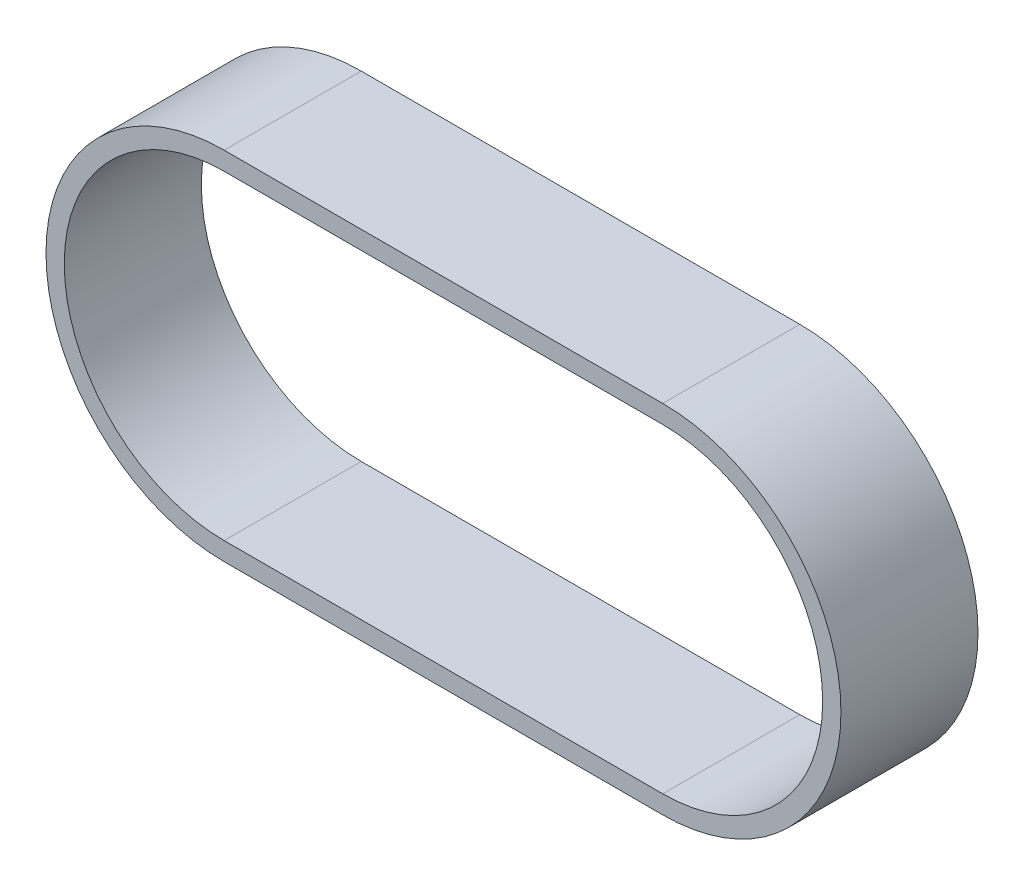
ISO-10303-21;
HEADER;
FILE_DESCRIPTION(('STEP AP214'),'2;1');
FILE_NAME('part.step','',(''),(''),'','','');
FILE_SCHEMA(('AUTOMOTIVE_DESIGN { 1 0 10303 214 1 1 1 1 }'));
ENDSEC;
DATA;
#1=APPLICATION_CONTEXT('core data for automotive mechanical design processes');
#2=APPLICATION_PROTOCOL_DEFINITION('international standard','automotive_design',2000,#1);
#3=PRODUCT_CONTEXT('',#1,'mechanical');
#4=PRODUCT('Part','Part','',(#3));
#5=PRODUCT_RELATED_PRODUCT_CATEGORY('part','',(#4));
#6=PRODUCT_DEFINITION_FORMATION('','',#4);
#7=PRODUCT_DEFINITION_CONTEXT('part definition',#1,'design');
#8=PRODUCT_DEFINITION('design','',#6,#7);
#9=PRODUCT_DEFINITION_SHAPE('','',#8);
#10=(LENGTH_UNIT() NAMED_UNIT(*) SI_UNIT(.MILLI.,.METRE.));
#11=(NAMED_UNIT(*) PLANE_ANGLE_UNIT() SI_UNIT($,.RADIAN.));
#12=(NAMED_UNIT(*) SI_UNIT($,.STERADIAN.) SOLID_ANGLE_UNIT());
#13=UNCERTAINTY_MEASURE_WITH_UNIT(LENGTH_MEASURE(1.E-05),#10,'distance_accuracy_value','');
#14=(GEOMETRIC_REPRESENTATION_CONTEXT(3) GLOBAL_UNCERTAINTY_ASSIGNED_CONTEXT((#13)) GLOBAL_UNIT_ASSIGNED_CONTEXT((#10,
#11,#12)) REPRESENTATION_CONTEXT('',''));
#15=CARTESIAN_POINT('',(0.,0.,0.));
#16=DIRECTION('',(0.,0.,1.));
#17=DIRECTION('',(1.,0.,0.));
#18=AXIS2_PLACEMENT_3D('',#15,#16,#17);
#19=CARTESIAN_POINT('',(-24.,0.,-7.5));
#20=DIRECTION('',(0.,0.,1.));
#21=DIRECTION('',(1.,0.,0.));
#22=AXIS2_PLACEMENT_3D('',#19,#20,#21);
#23=CYLINDRICAL_SURFACE('',#22,19.5);
#24=DIRECTION('',(0.,0.,1.));
#25=VECTOR('',#24,1.);
#26=CARTESIAN_POINT('',(-24.,-19.5,-7.5));
#27=LINE('',#26,#25);
#28=CARTESIAN_POINT('',(-24.,-19.5,-7.5));
#29=VERTEX_POINT('',#28);
#30=CARTESIAN_POINT('',(-24.,-19.5,7.5));
#31=VERTEX_POINT('',#30);
#32=EDGE_CURVE('E38',#29,#31,#27,.T.);
#33=ORIENTED_EDGE('',*,*,#32,.T.);
#34=CARTESIAN_POINT('',(-24.,0.,7.5));
#35=DIRECTION('',(0.,0.,1.));
#36=DIRECTION('',(-1.,0.,0.));
#37=AXIS2_PLACEMENT_3D('',#34,#35,#36);
#38=CIRCLE('',#37,19.5);
#39=CARTESIAN_POINT('',(-24.,19.5,7.5));
#40=VERTEX_POINT('',#39);
#41=EDGE_CURVE('E130',#40,#31,#38,.T.);
#42=ORIENTED_EDGE('',*,*,#41,.F.);
#43=DIRECTION('',(0.,0.,1.));
#44=VECTOR('',#43,1.);
#45=CARTESIAN_POINT('',(-24.,19.5,-7.5));
#46=LINE('',#45,#44);
#47=CARTESIAN_POINT('',(-24.,19.5,-7.5));
#48=VERTEX_POINT('',#47);
#49=EDGE_CURVE('E11',#48,#40,#46,.T.);
#50=ORIENTED_EDGE('',*,*,#49,.F.);
#51=CARTESIAN_POINT('',(-24.,0.,-7.5));
#52=DIRECTION('',(0.,0.,1.));
#53=DIRECTION('',(-1.,0.,0.));
#54=AXIS2_PLACEMENT_3D('',#51,#52,#53);
#55=CIRCLE('',#54,19.5);
#56=EDGE_CURVE('E149',#48,#29,#55,.T.);
#57=ORIENTED_EDGE('',*,*,#56,.T.);
#58=EDGE_LOOP('',(#33,#42,#50,#57));
#59=FACE_BOUND('',#58,.T.);
#60=ADVANCED_FACE('F35',(#59),#23,.T.);
#61=CARTESIAN_POINT('',(-24.,19.5,-7.5));
#62=DIRECTION('',(0.,1.,0.));
#63=DIRECTION('',(0.,0.,1.));
#64=AXIS2_PLACEMENT_3D('',#61,#62,#63);
#65=PLANE('',#64);
#66=ORIENTED_EDGE('',*,*,#49,.T.);
#67=DIRECTION('',(-1.,0.,0.));
#68=VECTOR('',#67,1.);
#69=CARTESIAN_POINT('',(-24.,19.5,7.5));
#70=LINE('',#69,#68);
#71=CARTESIAN_POINT('',(24.,19.5,7.5));
#72=VERTEX_POINT('',#71);
#73=EDGE_CURVE('E139',#72,#40,#70,.T.);
#74=ORIENTED_EDGE('',*,*,#73,.F.);
#75=DIRECTION('',(0.,0.,1.));
#76=VECTOR('',#75,1.);
#77=CARTESIAN_POINT('',(24.,19.5,-7.5));
#78=LINE('',#77,#76);
#79=CARTESIAN_POINT('',(24.,19.5,-7.5));
#80=VERTEX_POINT('',#79);
#81=EDGE_CURVE('E43',#80,#72,#78,.T.);
#82=ORIENTED_EDGE('',*,*,#81,.F.);
#83=DIRECTION('',(-1.,0.,0.));
#84=VECTOR('',#83,1.);
#85=CARTESIAN_POINT('',(-24.,19.5,-7.5));
#86=LINE('',#85,#84);
#87=EDGE_CURVE('E160',#80,#48,#86,.T.);
#88=ORIENTED_EDGE('',*,*,#87,.T.);
#89=EDGE_LOOP('',(#66,#74,#82,#88));
#90=FACE_BOUND('',#89,.T.);
#91=ADVANCED_FACE('F172',(#90),#65,.T.);
#92=CARTESIAN_POINT('',(24.,0.,-7.5));
#93=DIRECTION('',(0.,0.,1.));
#94=DIRECTION('',(1.,0.,0.));
#95=AXIS2_PLACEMENT_3D('',#92,#93,#94);
#96=CYLINDRICAL_SURFACE('',#95,19.5);
#97=ORIENTED_EDGE('',*,*,#81,.T.);
#98=CARTESIAN_POINT('',(24.,0.,7.5));
#99=DIRECTION('',(0.,0.,1.));
#100=DIRECTION('',(-1.,0.,0.));
#101=AXIS2_PLACEMENT_3D('',#98,#99,#100);
#102=CIRCLE('',#101,19.5);
#103=CARTESIAN_POINT('',(24.,-19.5,7.5));
#104=VERTEX_POINT('',#103);
#105=EDGE_CURVE('E136',#104,#72,#102,.T.);
#106=ORIENTED_EDGE('',*,*,#105,.F.);
#107=DIRECTION('',(0.,0.,1.));
#108=VECTOR('',#107,1.);
#109=CARTESIAN_POINT('',(24.,-19.5,-7.5));
#110=LINE('',#109,#108);
#111=CARTESIAN_POINT('',(24.,-19.5,-7.5));
#112=VERTEX_POINT('',#111);
#113=EDGE_CURVE('E163',#112,#104,#110,.T.);
#114=ORIENTED_EDGE('',*,*,#113,.F.);
#115=CARTESIAN_POINT('',(24.,0.,-7.5));
#116=DIRECTION('',(0.,0.,1.));
#117=DIRECTION('',(-1.,0.,0.));
#118=AXIS2_PLACEMENT_3D('',#115,#116,#117);
#119=CIRCLE('',#118,19.5);
#120=EDGE_CURVE('E157',#112,#80,#119,.T.);
#121=ORIENTED_EDGE('',*,*,#120,.T.);
#122=EDGE_LOOP('',(#97,#106,#114,#121));
#123=FACE_BOUND('',#122,.T.);
#124=ADVANCED_FACE('F178',(#123),#96,.T.);
#125=CARTESIAN_POINT('',(-24.,-19.5,-7.5));
#126=DIRECTION('',(0.,-1.,0.));
#127=DIRECTION('',(1.,0.,0.));
#128=AXIS2_PLACEMENT_3D('',#125,#126,#127);
#129=PLANE('',#128);
#130=ORIENTED_EDGE('',*,*,#113,.T.);
#131=DIRECTION('',(1.,0.,0.));
#132=VECTOR('',#131,1.);
#133=CARTESIAN_POINT('',(-24.,-19.5,7.5));
#134=LINE('',#133,#132);
#135=EDGE_CURVE('E133',#31,#104,#134,.T.);
#136=ORIENTED_EDGE('',*,*,#135,.F.);
#137=ORIENTED_EDGE('',*,*,#32,.F.);
#138=DIRECTION('',(1.,0.,0.));
#139=VECTOR('',#138,1.);
#140=CARTESIAN_POINT('',(-24.,-19.5,-7.5));
#141=LINE('',#140,#139);
#142=EDGE_CURVE('E154',#29,#112,#141,.T.);
#143=ORIENTED_EDGE('',*,*,#142,.T.);
#144=EDGE_LOOP('',(#130,#136,#137,#143));
#145=FACE_BOUND('',#144,.T.);
#146=ADVANCED_FACE('F167',(#145),#129,.T.);
#147=CARTESIAN_POINT('',(-24.,0.,-7.5));
#148=DIRECTION('',(0.,0.,-1.));
#149=DIRECTION('',(-1.,0.,0.));
#150=AXIS2_PLACEMENT_3D('',#147,#148,#149);
#151=PLANE('',#150);
#152=CARTESIAN_POINT('',(-24.,0.,-7.5));
#153=DIRECTION('',(0.,0.,1.));
#154=DIRECTION('',(-1.,0.,0.));
#155=AXIS2_PLACEMENT_3D('',#152,#153,#154);
#156=CIRCLE('',#155,17.5);
#157=CARTESIAN_POINT('',(-24.,17.5,-7.5));
#158=VERTEX_POINT('',#157);
#159=CARTESIAN_POINT('',(-24.,-17.5,-7.5));
#160=VERTEX_POINT('',#159);
#161=EDGE_CURVE('E142',#158,#160,#156,.T.);
#162=ORIENTED_EDGE('',*,*,#161,.T.);
#163=DIRECTION('',(1.,0.,0.));
#164=VECTOR('',#163,1.);
#165=CARTESIAN_POINT('',(-24.,-17.5,-7.5));
#166=LINE('',#165,#164);
#167=CARTESIAN_POINT('',(24.,-17.5,-7.5));
#168=VERTEX_POINT('',#167);
#169=EDGE_CURVE('E107',#160,#168,#166,.T.);
#170=ORIENTED_EDGE('',*,*,#169,.T.);
#171=CARTESIAN_POINT('',(24.,0.,-7.5));
#172=DIRECTION('',(0.,0.,1.));
#173=DIRECTION('',(-1.,0.,0.));
#174=AXIS2_PLACEMENT_3D('',#171,#172,#173);
#175=CIRCLE('',#174,17.5);
#176=CARTESIAN_POINT('',(24.,17.5,-7.5));
#177=VERTEX_POINT('',#176);
#178=EDGE_CURVE('E51',#168,#177,#175,.T.);
#179=ORIENTED_EDGE('',*,*,#178,.T.);
#180=DIRECTION('',(-1.,0.,0.));
#181=VECTOR('',#180,1.);
#182=CARTESIAN_POINT('',(-24.,17.5,-7.5));
#183=LINE('',#182,#181);
#184=EDGE_CURVE('E112',#177,#158,#183,.T.);
#185=ORIENTED_EDGE('',*,*,#184,.T.);
#186=EDGE_LOOP('',(#162,#170,#179,#185));
#187=FACE_BOUND('',#186,.T.);
#188=ORIENTED_EDGE('',*,*,#56,.F.);
#189=ORIENTED_EDGE('',*,*,#87,.F.);
#190=ORIENTED_EDGE('',*,*,#120,.F.);
#191=ORIENTED_EDGE('',*,*,#142,.F.);
#192=EDGE_LOOP('',(#188,#189,#190,#191));
#193=FACE_BOUND('',#192,.T.);
#194=ADVANCED_FACE('F176',(#187,#193),#151,.T.);
#195=CARTESIAN_POINT('',(-24.,0.,-7.5));
#196=DIRECTION('',(0.,0.,1.));
#197=DIRECTION('',(1.,0.,0.));
#198=AXIS2_PLACEMENT_3D('',#195,#196,#197);
#199=CYLINDRICAL_SURFACE('',#198,17.5);
#200=DIRECTION('',(0.,0.,1.));
#201=VECTOR('',#200,1.);
#202=CARTESIAN_POINT('',(-24.,17.5,-7.5));
#203=LINE('',#202,#201);
#204=CARTESIAN_POINT('',(-24.,17.5,7.5));
#205=VERTEX_POINT('',#204);
#206=EDGE_CURVE('E117',#158,#205,#203,.T.);
#207=ORIENTED_EDGE('',*,*,#206,.T.);
#208=CARTESIAN_POINT('',(-24.,0.,7.5));
#209=DIRECTION('',(0.,0.,1.));
#210=DIRECTION('',(-1.,0.,0.));
#211=AXIS2_PLACEMENT_3D('',#208,#209,#210);
#212=CIRCLE('',#211,17.5);
#213=CARTESIAN_POINT('',(-24.,-17.5,7.5));
#214=VERTEX_POINT('',#213);
#215=EDGE_CURVE('E115',#205,#214,#212,.T.);
#216=ORIENTED_EDGE('',*,*,#215,.T.);
#217=DIRECTION('',(0.,0.,1.));
#218=VECTOR('',#217,1.);
#219=CARTESIAN_POINT('',(-24.,-17.5,-7.5));
#220=LINE('',#219,#218);
#221=EDGE_CURVE('E100',#160,#214,#220,.T.);
#222=ORIENTED_EDGE('',*,*,#221,.F.);
#223=ORIENTED_EDGE('',*,*,#161,.F.);
#224=EDGE_LOOP('',(#207,#216,#222,#223));
#225=FACE_BOUND('',#224,.T.);
#226=ADVANCED_FACE('F116',(#225),#199,.F.);
#227=CARTESIAN_POINT('',(-24.,17.5,-7.5));
#228=DIRECTION('',(0.,1.,0.));
#229=DIRECTION('',(-1.,0.,0.));
#230=AXIS2_PLACEMENT_3D('',#227,#228,#229);
#231=PLANE('',#230);
#232=DIRECTION('',(0.,0.,1.));
#233=VECTOR('',#232,1.);
#234=CARTESIAN_POINT('',(24.,17.5,-7.5));
#235=LINE('',#234,#233);
#236=CARTESIAN_POINT('',(24.,17.5,7.5));
#237=VERTEX_POINT('',#236);
#238=EDGE_CURVE('E150',#177,#237,#235,.T.);
#239=ORIENTED_EDGE('',*,*,#238,.T.);
#240=DIRECTION('',(-1.,0.,0.));
#241=VECTOR('',#240,1.);
#242=CARTESIAN_POINT('',(-24.,17.5,7.5));
#243=LINE('',#242,#241);
#244=EDGE_CURVE('E126',#237,#205,#243,.T.);
#245=ORIENTED_EDGE('',*,*,#244,.T.);
#246=ORIENTED_EDGE('',*,*,#206,.F.);
#247=ORIENTED_EDGE('',*,*,#184,.F.);
#248=EDGE_LOOP('',(#239,#245,#246,#247));
#249=FACE_BOUND('',#248,.T.);
#250=ADVANCED_FACE('F221',(#249),#231,.F.);
#251=CARTESIAN_POINT('',(24.,0.,-7.5));
#252=DIRECTION('',(0.,0.,1.));
#253=DIRECTION('',(1.,0.,0.));
#254=AXIS2_PLACEMENT_3D('',#251,#252,#253);
#255=CYLINDRICAL_SURFACE('',#254,17.5);
#256=DIRECTION('',(0.,0.,1.));
#257=VECTOR('',#256,1.);
#258=CARTESIAN_POINT('',(24.,-17.5,-7.5));
#259=LINE('',#258,#257);
#260=CARTESIAN_POINT('',(24.,-17.5,7.5));
#261=VERTEX_POINT('',#260);
#262=EDGE_CURVE('E111',#168,#261,#259,.T.);
#263=ORIENTED_EDGE('',*,*,#262,.T.);
#264=CARTESIAN_POINT('',(24.,0.,7.5));
#265=DIRECTION('',(0.,0.,1.));
#266=DIRECTION('',(-1.,0.,0.));
#267=AXIS2_PLACEMENT_3D('',#264,#265,#266);
#268=CIRCLE('',#267,17.5);
#269=EDGE_CURVE('E124',#261,#237,#268,.T.);
#270=ORIENTED_EDGE('',*,*,#269,.T.);
#271=ORIENTED_EDGE('',*,*,#238,.F.);
#272=ORIENTED_EDGE('',*,*,#178,.F.);
#273=EDGE_LOOP('',(#263,#270,#271,#272));
#274=FACE_BOUND('',#273,.T.);
#275=ADVANCED_FACE('F230',(#274),#255,.F.);
#276=CARTESIAN_POINT('',(-24.,-17.5,-7.5));
#277=DIRECTION('',(0.,-1.,0.));
#278=DIRECTION('',(1.,0.,0.));
#279=AXIS2_PLACEMENT_3D('',#276,#277,#278);
#280=PLANE('',#279);
#281=ORIENTED_EDGE('',*,*,#221,.T.);
#282=DIRECTION('',(1.,0.,0.));
#283=VECTOR('',#282,1.);
#284=CARTESIAN_POINT('',(-24.,-17.5,7.5));
#285=LINE('',#284,#283);
#286=EDGE_CURVE('E104',#214,#261,#285,.T.);
#287=ORIENTED_EDGE('',*,*,#286,.T.);
#288=ORIENTED_EDGE('',*,*,#262,.F.);
#289=ORIENTED_EDGE('',*,*,#169,.F.);
#290=EDGE_LOOP('',(#281,#287,#288,#289));
#291=FACE_BOUND('',#290,.T.);
#292=ADVANCED_FACE('F102',(#291),#280,.F.);
#293=CARTESIAN_POINT('',(-24.,0.,7.5));
#294=DIRECTION('',(0.,0.,-1.));
#295=DIRECTION('',(-1.,0.,0.));
#296=AXIS2_PLACEMENT_3D('',#293,#294,#295);
#297=PLANE('',#296);
#298=ORIENTED_EDGE('',*,*,#41,.T.);
#299=ORIENTED_EDGE('',*,*,#135,.T.);
#300=ORIENTED_EDGE('',*,*,#105,.T.);
#301=ORIENTED_EDGE('',*,*,#73,.T.);
#302=EDGE_LOOP('',(#298,#299,#300,#301));
#303=FACE_BOUND('',#302,.T.);
#304=ORIENTED_EDGE('',*,*,#215,.F.);
#305=ORIENTED_EDGE('',*,*,#244,.F.);
#306=ORIENTED_EDGE('',*,*,#269,.F.);
#307=ORIENTED_EDGE('',*,*,#286,.F.);
#308=EDGE_LOOP('',(#304,#305,#306,#307));
#309=FACE_BOUND('',#308,.T.);
#310=ADVANCED_FACE('F122',(#303,#309),#297,.F.);
#311=CLOSED_SHELL('',(#60,#91,#124,#146,#194,#226,#250,#275,#292,#310));
#312=MANIFOLD_SOLID_BREP('B2',#311);
#313=ADVANCED_BREP_SHAPE_REPRESENTATION('',(#18,#312),#14);
#314=SHAPE_DEFINITION_REPRESENTATION(#9,#313);
ENDSEC;
END-ISO-10303-21;
